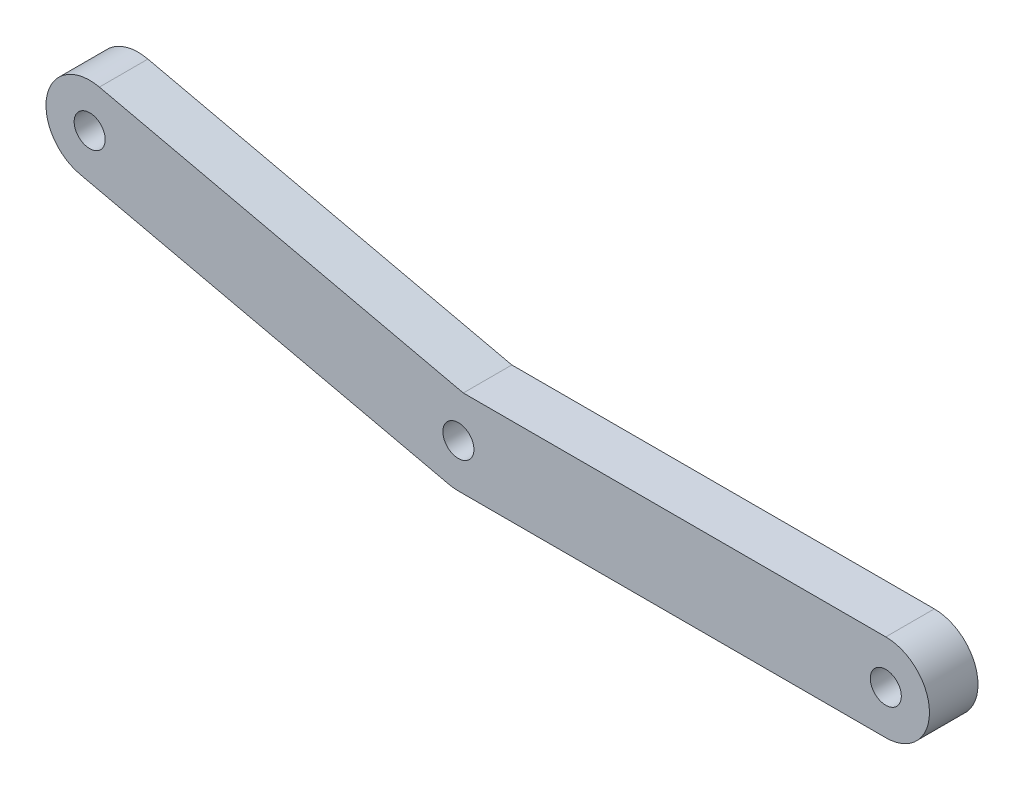
ISO-10303-21;
HEADER;
FILE_DESCRIPTION(('STEP AP214'),'2;1');
FILE_NAME('part.step','',(''),(''),'','','');
FILE_SCHEMA(('AUTOMOTIVE_DESIGN { 1 0 10303 214 1 1 1 1 }'));
ENDSEC;
DATA;
#1=APPLICATION_CONTEXT('core data for automotive mechanical design processes');
#2=APPLICATION_PROTOCOL_DEFINITION('international standard','automotive_design',2000,#1);
#3=PRODUCT_CONTEXT('',#1,'mechanical');
#4=PRODUCT('Part','Part','',(#3));
#5=PRODUCT_RELATED_PRODUCT_CATEGORY('part','',(#4));
#6=PRODUCT_DEFINITION_FORMATION('','',#4);
#7=PRODUCT_DEFINITION_CONTEXT('part definition',#1,'design');
#8=PRODUCT_DEFINITION('design','',#6,#7);
#9=PRODUCT_DEFINITION_SHAPE('','',#8);
#10=(LENGTH_UNIT() NAMED_UNIT(*) SI_UNIT(.MILLI.,.METRE.));
#11=(NAMED_UNIT(*) PLANE_ANGLE_UNIT() SI_UNIT($,.RADIAN.));
#12=(NAMED_UNIT(*) SI_UNIT($,.STERADIAN.) SOLID_ANGLE_UNIT());
#13=UNCERTAINTY_MEASURE_WITH_UNIT(LENGTH_MEASURE(1.E-05),#10,'distance_accuracy_value','');
#14=(GEOMETRIC_REPRESENTATION_CONTEXT(3) GLOBAL_UNCERTAINTY_ASSIGNED_CONTEXT((#13)) GLOBAL_UNIT_ASSIGNED_CONTEXT((#10,
#11,#12)) REPRESENTATION_CONTEXT('',''));
#15=CARTESIAN_POINT('',(0.,0.,0.));
#16=DIRECTION('',(0.,0.,1.));
#17=DIRECTION('',(1.,0.,0.));
#18=AXIS2_PLACEMENT_3D('',#15,#16,#17);
#19=CARTESIAN_POINT('',(-64.02985074626,0.,5.5));
#20=DIRECTION('',(0.,0.,1.));
#21=DIRECTION('',(1.,0.,0.));
#22=AXIS2_PLACEMENT_3D('',#19,#20,#21);
#23=CYLINDRICAL_SURFACE('',#22,1.6);
#24=DIRECTION('',(0.,0.,1.));
#25=VECTOR('',#24,1.);
#26=CARTESIAN_POINT('',(-62.42985074626,0.,5.5));
#27=LINE('',#26,#25);
#28=CARTESIAN_POINT('',(-62.42985074626,0.,13.));
#29=VERTEX_POINT('',#28);
#30=CARTESIAN_POINT('',(-62.42985074626,0.,18.));
#31=VERTEX_POINT('',#30);
#32=EDGE_CURVE('E10',#29,#31,#27,.T.);
#33=ORIENTED_EDGE('',*,*,#32,.F.);
#34=CARTESIAN_POINT('',(-64.02985074626,0.,13.));
#35=DIRECTION('',(0.,0.,1.));
#36=DIRECTION('',(1.,0.,0.));
#37=AXIS2_PLACEMENT_3D('',#34,#35,#36);
#38=CIRCLE('',#37,1.6);
#39=EDGE_CURVE('E164',#29,#29,#38,.T.);
#40=ORIENTED_EDGE('',*,*,#39,.F.);
#41=ORIENTED_EDGE('',*,*,#32,.T.);
#42=CARTESIAN_POINT('',(-64.02985074626,0.,18.));
#43=DIRECTION('',(0.,0.,1.));
#44=DIRECTION('',(1.,0.,0.));
#45=AXIS2_PLACEMENT_3D('',#42,#43,#44);
#46=CIRCLE('',#45,1.6);
#47=EDGE_CURVE('E201',#31,#31,#46,.T.);
#48=ORIENTED_EDGE('',*,*,#47,.T.);
#49=EDGE_LOOP('',(#33,#40,#41,#48));
#50=FACE_BOUND('',#49,.T.);
#51=ADVANCED_FACE('F16',(#50),#23,.F.);
#52=CARTESIAN_POINT('',(-20.,0.,5.5));
#53=DIRECTION('',(0.,0.,1.));
#54=DIRECTION('',(1.,0.,0.));
#55=AXIS2_PLACEMENT_3D('',#52,#53,#54);
#56=CYLINDRICAL_SURFACE('',#55,1.6);
#57=DIRECTION('',(0.,0.,1.));
#58=VECTOR('',#57,1.);
#59=CARTESIAN_POINT('',(-18.4,0.,5.5));
#60=LINE('',#59,#58);
#61=CARTESIAN_POINT('',(-18.4,0.,13.));
#62=VERTEX_POINT('',#61);
#63=CARTESIAN_POINT('',(-18.4,0.,18.));
#64=VERTEX_POINT('',#63);
#65=EDGE_CURVE('E27',#62,#64,#60,.T.);
#66=ORIENTED_EDGE('',*,*,#65,.F.);
#67=CARTESIAN_POINT('',(-20.,0.,13.));
#68=DIRECTION('',(0.,0.,1.));
#69=DIRECTION('',(1.,0.,0.));
#70=AXIS2_PLACEMENT_3D('',#67,#68,#69);
#71=CIRCLE('',#70,1.6);
#72=EDGE_CURVE('E168',#62,#62,#71,.T.);
#73=ORIENTED_EDGE('',*,*,#72,.F.);
#74=ORIENTED_EDGE('',*,*,#65,.T.);
#75=CARTESIAN_POINT('',(-20.,0.,18.));
#76=DIRECTION('',(0.,0.,1.));
#77=DIRECTION('',(1.,0.,0.));
#78=AXIS2_PLACEMENT_3D('',#75,#76,#77);
#79=CIRCLE('',#78,1.6);
#80=EDGE_CURVE('E205',#64,#64,#79,.T.);
#81=ORIENTED_EDGE('',*,*,#80,.T.);
#82=EDGE_LOOP('',(#66,#73,#74,#81));
#83=FACE_BOUND('',#82,.T.);
#84=ADVANCED_FACE('F265',(#83),#56,.F.);
#85=CARTESIAN_POINT('',(-102.0149253731,8.65671641791,5.5));
#86=DIRECTION('',(0.,0.,1.));
#87=DIRECTION('',(1.,0.,0.));
#88=AXIS2_PLACEMENT_3D('',#85,#86,#87);
#89=CYLINDRICAL_SURFACE('',#88,1.6);
#90=DIRECTION('',(0.,0.,1.));
#91=VECTOR('',#90,1.);
#92=CARTESIAN_POINT('',(-100.4149253731,8.65671641791,5.5));
#93=LINE('',#92,#91);
#94=CARTESIAN_POINT('',(-100.4149253731,8.65671641791,13.));
#95=VERTEX_POINT('',#94);
#96=CARTESIAN_POINT('',(-100.4149253731,8.65671641791,18.));
#97=VERTEX_POINT('',#96);
#98=EDGE_CURVE('E193',#95,#97,#93,.T.);
#99=ORIENTED_EDGE('',*,*,#98,.F.);
#100=CARTESIAN_POINT('',(-102.0149253731,8.65671641791,13.));
#101=DIRECTION('',(0.,0.,1.));
#102=DIRECTION('',(1.,0.,0.));
#103=AXIS2_PLACEMENT_3D('',#100,#101,#102);
#104=CIRCLE('',#103,1.6);
#105=EDGE_CURVE('E181',#95,#95,#104,.T.);
#106=ORIENTED_EDGE('',*,*,#105,.F.);
#107=ORIENTED_EDGE('',*,*,#98,.T.);
#108=CARTESIAN_POINT('',(-102.0149253731,8.65671641791,18.));
#109=DIRECTION('',(0.,0.,1.));
#110=DIRECTION('',(1.,0.,0.));
#111=AXIS2_PLACEMENT_3D('',#108,#109,#110);
#112=CIRCLE('',#111,1.6);
#113=EDGE_CURVE('E134',#97,#97,#112,.T.);
#114=ORIENTED_EDGE('',*,*,#113,.T.);
#115=EDGE_LOOP('',(#99,#106,#107,#114));
#116=FACE_BOUND('',#115,.T.);
#117=ADVANCED_FACE('F270',(#116),#89,.F.);
#118=CARTESIAN_POINT('',(-64.02985074626,0.,13.));
#119=DIRECTION('',(0.,0.,-1.));
#120=DIRECTION('',(1.,0.,0.));
#121=AXIS2_PLACEMENT_3D('',#118,#119,#120);
#122=CYLINDRICAL_SURFACE('',#121,4.5);
#123=DIRECTION('',(0.,0.,1.));
#124=VECTOR('',#123,1.);
#125=CARTESIAN_POINT('',(-64.02985074626,-4.5,13.));
#126=LINE('',#125,#124);
#127=CARTESIAN_POINT('',(-64.02985074626,-4.5,13.));
#128=VERTEX_POINT('',#127);
#129=CARTESIAN_POINT('',(-64.02985074626,-4.5,18.));
#130=VERTEX_POINT('',#129);
#131=EDGE_CURVE('E215',#128,#130,#126,.T.);
#132=ORIENTED_EDGE('',*,*,#131,.T.);
#133=CARTESIAN_POINT('',(-64.02985074626,0.,18.));
#134=DIRECTION('',(0.,0.,-1.));
#135=DIRECTION('',(1.,0.,0.));
#136=AXIS2_PLACEMENT_3D('',#133,#134,#135);
#137=CIRCLE('',#136,4.5);
#138=CARTESIAN_POINT('',(-65.02975350703,-4.38750435544,18.));
#139=VERTEX_POINT('',#138);
#140=EDGE_CURVE('E182',#130,#139,#137,.T.);
#141=ORIENTED_EDGE('',*,*,#140,.T.);
#142=DIRECTION('',(0.,0.,1.));
#143=VECTOR('',#142,1.);
#144=CARTESIAN_POINT('',(-65.02975350703,-4.38750435544,13.));
#145=LINE('',#144,#143);
#146=CARTESIAN_POINT('',(-65.02975350703,-4.38750435544,13.));
#147=VERTEX_POINT('',#146);
#148=EDGE_CURVE('E200',#147,#139,#145,.T.);
#149=ORIENTED_EDGE('',*,*,#148,.F.);
#150=CARTESIAN_POINT('',(-64.02985074626,0.,13.));
#151=DIRECTION('',(0.,0.,-1.));
#152=DIRECTION('',(1.,0.,0.));
#153=AXIS2_PLACEMENT_3D('',#150,#151,#152);
#154=CIRCLE('',#153,4.5);
#155=EDGE_CURVE('E172',#128,#147,#154,.T.);
#156=ORIENTED_EDGE('',*,*,#155,.F.);
#157=EDGE_LOOP('',(#132,#141,#149,#156));
#158=FACE_BOUND('',#157,.T.);
#159=ADVANCED_FACE('F18',(#158),#122,.T.);
#160=CARTESIAN_POINT('',(-64.02985074626,-4.5,13.));
#161=DIRECTION('',(0.,1.,0.));
#162=DIRECTION('',(1.,0.,0.));
#163=AXIS2_PLACEMENT_3D('',#160,#161,#162);
#164=PLANE('',#163);
#165=DIRECTION('',(1.,0.,0.));
#166=VECTOR('',#165,1.);
#167=CARTESIAN_POINT('',(-64.02985074626,-4.5,13.));
#168=LINE('',#167,#166);
#169=CARTESIAN_POINT('',(-20.,-4.5,13.));
#170=VERTEX_POINT('',#169);
#171=EDGE_CURVE('E177',#128,#170,#168,.T.);
#172=ORIENTED_EDGE('',*,*,#171,.T.);
#173=DIRECTION('',(0.,0.,1.));
#174=VECTOR('',#173,1.);
#175=CARTESIAN_POINT('',(-20.,-4.5,13.));
#176=LINE('',#175,#174);
#177=CARTESIAN_POINT('',(-20.,-4.5,18.));
#178=VERTEX_POINT('',#177);
#179=EDGE_CURVE('E196',#170,#178,#176,.T.);
#180=ORIENTED_EDGE('',*,*,#179,.T.);
#181=DIRECTION('',(1.,0.,0.));
#182=VECTOR('',#181,1.);
#183=CARTESIAN_POINT('',(-64.02985074626,-4.5,18.));
#184=LINE('',#183,#182);
#185=EDGE_CURVE('E131',#130,#178,#184,.T.);
#186=ORIENTED_EDGE('',*,*,#185,.F.);
#187=ORIENTED_EDGE('',*,*,#131,.F.);
#188=EDGE_LOOP('',(#172,#180,#186,#187));
#189=FACE_BOUND('',#188,.T.);
#190=ADVANCED_FACE('F239',(#189),#164,.F.);
#191=CARTESIAN_POINT('',(-103.0148281339,4.26921206247,13.));
#192=DIRECTION('',(0.222200613503923,0.975000967875663,0.));
#193=DIRECTION('',(0.,0.,-1.));
#194=AXIS2_PLACEMENT_3D('',#191,#192,#193);
#195=PLANE('',#194);
#196=DIRECTION('',(0.975000967875663,-0.222200613503923,0.));
#197=VECTOR('',#196,1.);
#198=CARTESIAN_POINT('',(-103.0148281339,4.26921206247,13.));
#199=LINE('',#198,#197);
#200=CARTESIAN_POINT('',(-103.0148281339,4.26921206247,13.));
#201=VERTEX_POINT('',#200);
#202=EDGE_CURVE('E176',#201,#147,#199,.T.);
#203=ORIENTED_EDGE('',*,*,#202,.T.);
#204=ORIENTED_EDGE('',*,*,#148,.T.);
#205=DIRECTION('',(0.975000967875663,-0.222200613503923,0.));
#206=VECTOR('',#205,1.);
#207=CARTESIAN_POINT('',(-103.0148281339,4.26921206247,18.));
#208=LINE('',#207,#206);
#209=CARTESIAN_POINT('',(-103.0148281339,4.26921206247,18.));
#210=VERTEX_POINT('',#209);
#211=EDGE_CURVE('E167',#210,#139,#208,.T.);
#212=ORIENTED_EDGE('',*,*,#211,.F.);
#213=DIRECTION('',(0.,0.,1.));
#214=VECTOR('',#213,1.);
#215=CARTESIAN_POINT('',(-103.0148281339,4.26921206247,13.));
#216=LINE('',#215,#214);
#217=EDGE_CURVE('E143',#201,#210,#216,.T.);
#218=ORIENTED_EDGE('',*,*,#217,.F.);
#219=EDGE_LOOP('',(#203,#204,#212,#218));
#220=FACE_BOUND('',#219,.T.);
#221=ADVANCED_FACE('F243',(#220),#195,.F.);
#222=CARTESIAN_POINT('',(-20.,0.,13.));
#223=DIRECTION('',(0.,0.,-1.));
#224=DIRECTION('',(-1.,0.,0.));
#225=AXIS2_PLACEMENT_3D('',#222,#223,#224);
#226=CYLINDRICAL_SURFACE('',#225,4.5);
#227=DIRECTION('',(0.,0.,1.));
#228=VECTOR('',#227,1.);
#229=CARTESIAN_POINT('',(-20.,4.5,13.));
#230=LINE('',#229,#228);
#231=CARTESIAN_POINT('',(-20.,4.5,13.));
#232=VERTEX_POINT('',#231);
#233=CARTESIAN_POINT('',(-20.,4.5,18.));
#234=VERTEX_POINT('',#233);
#235=EDGE_CURVE('E136',#232,#234,#230,.T.);
#236=ORIENTED_EDGE('',*,*,#235,.T.);
#237=CARTESIAN_POINT('',(-20.,0.,18.));
#238=DIRECTION('',(0.,0.,-1.));
#239=DIRECTION('',(-1.,0.,0.));
#240=AXIS2_PLACEMENT_3D('',#237,#238,#239);
#241=CIRCLE('',#240,4.5);
#242=EDGE_CURVE('E20',#234,#178,#241,.T.);
#243=ORIENTED_EDGE('',*,*,#242,.T.);
#244=ORIENTED_EDGE('',*,*,#179,.F.);
#245=CARTESIAN_POINT('',(-20.,0.,13.));
#246=DIRECTION('',(0.,0.,-1.));
#247=DIRECTION('',(-1.,0.,0.));
#248=AXIS2_PLACEMENT_3D('',#245,#246,#247);
#249=CIRCLE('',#248,4.5);
#250=EDGE_CURVE('E139',#232,#170,#249,.T.);
#251=ORIENTED_EDGE('',*,*,#250,.F.);
#252=EDGE_LOOP('',(#236,#243,#244,#251));
#253=FACE_BOUND('',#252,.T.);
#254=ADVANCED_FACE('F137',(#253),#226,.T.);
#255=CARTESIAN_POINT('',(-42.01492537313,0.,18.));
#256=DIRECTION('',(0.,0.,1.));
#257=DIRECTION('',(1.,0.,0.));
#258=AXIS2_PLACEMENT_3D('',#255,#256,#257);
#259=PLANE('',#258);
#260=ORIENTED_EDGE('',*,*,#47,.F.);
#261=EDGE_LOOP('',(#260));
#262=FACE_BOUND('',#261,.T.);
#263=ORIENTED_EDGE('',*,*,#80,.F.);
#264=EDGE_LOOP('',(#263));
#265=FACE_BOUND('',#264,.T.);
#266=ORIENTED_EDGE('',*,*,#113,.F.);
#267=EDGE_LOOP('',(#266));
#268=FACE_BOUND('',#267,.T.);
#269=DIRECTION('',(-0.975000967875663,0.222200613503923,0.));
#270=VECTOR('',#269,1.);
#271=CARTESIAN_POINT('',(-63.5235711155,4.5,18.));
#272=LINE('',#271,#270);
#273=CARTESIAN_POINT('',(-63.5235711155,4.5,18.));
#274=VERTEX_POINT('',#273);
#275=CARTESIAN_POINT('',(-101.0150226123,13.044220773351,18.));
#276=VERTEX_POINT('',#275);
#277=EDGE_CURVE('E162',#274,#276,#272,.T.);
#278=ORIENTED_EDGE('',*,*,#277,.T.);
#279=CARTESIAN_POINT('',(-102.0149253731,8.65671641791,18.));
#280=DIRECTION('',(0.,0.,-1.));
#281=DIRECTION('',(0.975000967875663,-0.222200613503923,0.));
#282=AXIS2_PLACEMENT_3D('',#279,#280,#281);
#283=CIRCLE('',#282,4.5);
#284=EDGE_CURVE('E87',#210,#276,#283,.T.);
#285=ORIENTED_EDGE('',*,*,#284,.F.);
#286=ORIENTED_EDGE('',*,*,#211,.T.);
#287=ORIENTED_EDGE('',*,*,#140,.F.);
#288=ORIENTED_EDGE('',*,*,#185,.T.);
#289=ORIENTED_EDGE('',*,*,#242,.F.);
#290=DIRECTION('',(-1.,0.,0.));
#291=VECTOR('',#290,1.);
#292=CARTESIAN_POINT('',(-20.,4.5,18.));
#293=LINE('',#292,#291);
#294=EDGE_CURVE('E127',#234,#274,#293,.T.);
#295=ORIENTED_EDGE('',*,*,#294,.T.);
#296=EDGE_LOOP('',(#278,#285,#286,#287,#288,#289,#295));
#297=FACE_BOUND('',#296,.T.);
#298=ADVANCED_FACE('F125',(#262,#265,#268,#297),#259,.T.);
#299=CARTESIAN_POINT('',(-42.01492537313,0.,13.));
#300=DIRECTION('',(0.,0.,1.));
#301=DIRECTION('',(1.,0.,0.));
#302=AXIS2_PLACEMENT_3D('',#299,#300,#301);
#303=PLANE('',#302);
#304=ORIENTED_EDGE('',*,*,#39,.T.);
#305=EDGE_LOOP('',(#304));
#306=FACE_BOUND('',#305,.T.);
#307=ORIENTED_EDGE('',*,*,#72,.T.);
#308=EDGE_LOOP('',(#307));
#309=FACE_BOUND('',#308,.T.);
#310=ORIENTED_EDGE('',*,*,#105,.T.);
#311=EDGE_LOOP('',(#310));
#312=FACE_BOUND('',#311,.T.);
#313=DIRECTION('',(-1.,0.,0.));
#314=VECTOR('',#313,1.);
#315=CARTESIAN_POINT('',(-20.,4.5,13.));
#316=LINE('',#315,#314);
#317=CARTESIAN_POINT('',(-63.5235711155,4.5,13.));
#318=VERTEX_POINT('',#317);
#319=EDGE_CURVE('E150',#232,#318,#316,.T.);
#320=ORIENTED_EDGE('',*,*,#319,.F.);
#321=ORIENTED_EDGE('',*,*,#250,.T.);
#322=ORIENTED_EDGE('',*,*,#171,.F.);
#323=ORIENTED_EDGE('',*,*,#155,.T.);
#324=ORIENTED_EDGE('',*,*,#202,.F.);
#325=CARTESIAN_POINT('',(-102.0149253731,8.65671641791,13.));
#326=DIRECTION('',(0.,0.,-1.));
#327=DIRECTION('',(0.975000967875663,-0.222200613503923,0.));
#328=AXIS2_PLACEMENT_3D('',#325,#326,#327);
#329=CIRCLE('',#328,4.5);
#330=CARTESIAN_POINT('',(-101.0150226123,13.044220773351,13.));
#331=VERTEX_POINT('',#330);
#332=EDGE_CURVE('E99',#201,#331,#329,.T.);
#333=ORIENTED_EDGE('',*,*,#332,.T.);
#334=DIRECTION('',(-0.975000967875663,0.222200613503923,0.));
#335=VECTOR('',#334,1.);
#336=CARTESIAN_POINT('',(-63.5235711155,4.5,13.));
#337=LINE('',#336,#335);
#338=EDGE_CURVE('E163',#318,#331,#337,.T.);
#339=ORIENTED_EDGE('',*,*,#338,.F.);
#340=EDGE_LOOP('',(#320,#321,#322,#323,#324,#333,#339));
#341=FACE_BOUND('',#340,.T.);
#342=ADVANCED_FACE('F248',(#306,#309,#312,#341),#303,.F.);
#343=CARTESIAN_POINT('',(-102.0149253731,8.65671641791,13.));
#344=DIRECTION('',(0.,0.,-1.));
#345=DIRECTION('',(0.975000967875663,-0.222200613503923,0.));
#346=AXIS2_PLACEMENT_3D('',#343,#344,#345);
#347=CYLINDRICAL_SURFACE('',#346,4.5);
#348=ORIENTED_EDGE('',*,*,#217,.T.);
#349=ORIENTED_EDGE('',*,*,#284,.T.);
#350=DIRECTION('',(0.,0.,1.));
#351=VECTOR('',#350,1.);
#352=CARTESIAN_POINT('',(-101.0150226123,13.044220773351,13.));
#353=LINE('',#352,#351);
#354=EDGE_CURVE('E159',#331,#276,#353,.T.);
#355=ORIENTED_EDGE('',*,*,#354,.F.);
#356=ORIENTED_EDGE('',*,*,#332,.F.);
#357=EDGE_LOOP('',(#348,#349,#355,#356));
#358=FACE_BOUND('',#357,.T.);
#359=ADVANCED_FACE('F252',(#358),#347,.T.);
#360=CARTESIAN_POINT('',(-20.,4.5,13.));
#361=DIRECTION('',(0.,-1.,0.));
#362=DIRECTION('',(-1.,0.,0.));
#363=AXIS2_PLACEMENT_3D('',#360,#361,#362);
#364=PLANE('',#363);
#365=ORIENTED_EDGE('',*,*,#319,.T.);
#366=DIRECTION('',(0.,0.,1.));
#367=VECTOR('',#366,1.);
#368=CARTESIAN_POINT('',(-63.5235711155,4.5,13.));
#369=LINE('',#368,#367);
#370=EDGE_CURVE('E147',#318,#274,#369,.T.);
#371=ORIENTED_EDGE('',*,*,#370,.T.);
#372=ORIENTED_EDGE('',*,*,#294,.F.);
#373=ORIENTED_EDGE('',*,*,#235,.F.);
#374=EDGE_LOOP('',(#365,#371,#372,#373));
#375=FACE_BOUND('',#374,.T.);
#376=ADVANCED_FACE('F145',(#375),#364,.F.);
#377=CARTESIAN_POINT('',(-63.5235711155,4.5,13.));
#378=DIRECTION('',(-0.222200613503923,-0.975000967875663,0.));
#379=DIRECTION('',(-0.975000967875663,0.222200613503923,0.));
#380=AXIS2_PLACEMENT_3D('',#377,#378,#379);
#381=PLANE('',#380);
#382=ORIENTED_EDGE('',*,*,#338,.T.);
#383=ORIENTED_EDGE('',*,*,#354,.T.);
#384=ORIENTED_EDGE('',*,*,#277,.F.);
#385=ORIENTED_EDGE('',*,*,#370,.F.);
#386=EDGE_LOOP('',(#382,#383,#384,#385));
#387=FACE_BOUND('',#386,.T.);
#388=ADVANCED_FACE('F251',(#387),#381,.F.);
#389=CLOSED_SHELL('',(#51,#84,#117,#159,#190,#221,#254,#298,#342,#359,#376,#388));
#390=MANIFOLD_SOLID_BREP('B1',#389);
#391=ADVANCED_BREP_SHAPE_REPRESENTATION('',(#18,#390),#14);
#392=SHAPE_DEFINITION_REPRESENTATION(#9,#391);
ENDSEC;
END-ISO-10303-21;
